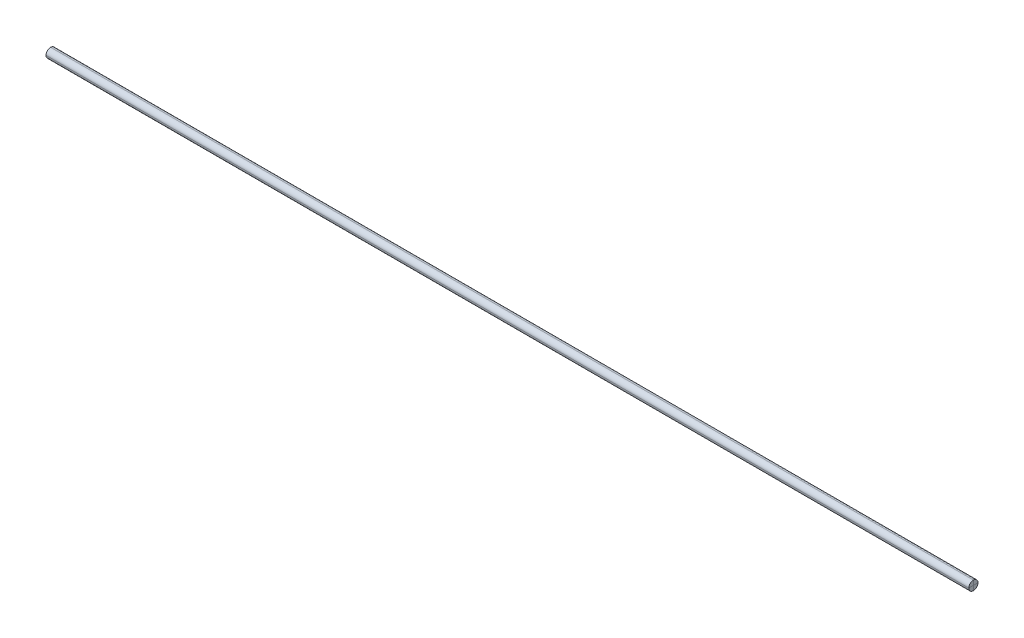
ISO-10303-21;
HEADER;
FILE_DESCRIPTION(('STEP AP214'),'2;1');
FILE_NAME('part.step','',(''),(''),'','','');
FILE_SCHEMA(('AUTOMOTIVE_DESIGN { 1 0 10303 214 1 1 1 1 }'));
ENDSEC;
DATA;
#1=APPLICATION_CONTEXT('core data for automotive mechanical design processes');
#2=APPLICATION_PROTOCOL_DEFINITION('international standard','automotive_design',2000,#1);
#3=PRODUCT_CONTEXT('',#1,'mechanical');
#4=PRODUCT('Part','Part','',(#3));
#5=PRODUCT_RELATED_PRODUCT_CATEGORY('part','',(#4));
#6=PRODUCT_DEFINITION_FORMATION('','',#4);
#7=PRODUCT_DEFINITION_CONTEXT('part definition',#1,'design');
#8=PRODUCT_DEFINITION('design','',#6,#7);
#9=PRODUCT_DEFINITION_SHAPE('','',#8);
#10=(LENGTH_UNIT() NAMED_UNIT(*) SI_UNIT(.MILLI.,.METRE.));
#11=(NAMED_UNIT(*) PLANE_ANGLE_UNIT() SI_UNIT($,.RADIAN.));
#12=(NAMED_UNIT(*) SI_UNIT($,.STERADIAN.) SOLID_ANGLE_UNIT());
#13=UNCERTAINTY_MEASURE_WITH_UNIT(LENGTH_MEASURE(1.E-05),#10,'distance_accuracy_value','');
#14=(GEOMETRIC_REPRESENTATION_CONTEXT(3) GLOBAL_UNCERTAINTY_ASSIGNED_CONTEXT((#13)) GLOBAL_UNIT_ASSIGNED_CONTEXT((#10,
#11,#12)) REPRESENTATION_CONTEXT('',''));
#15=CARTESIAN_POINT('',(0.,0.,0.));
#16=DIRECTION('',(0.,0.,1.));
#17=DIRECTION('',(1.,0.,0.));
#18=AXIS2_PLACEMENT_3D('',#15,#16,#17);
#19=CARTESIAN_POINT('',(0.,0.,0.));
#20=DIRECTION('',(0.,1.,0.));
#21=DIRECTION('',(0.,0.,1.));
#22=AXIS2_PLACEMENT_3D('',#19,#20,#21);
#23=PLANE('',#22);
#24=DIRECTION('',(0.,0.,1.));
#25=VECTOR('',#24,1.);
#26=CARTESIAN_POINT('',(1000.,0.,0.));
#27=LINE('',#26,#25);
#28=CARTESIAN_POINT('',(1000.,0.,-5.));
#29=VERTEX_POINT('',#28);
#30=CARTESIAN_POINT('',(1000.,0.,0.));
#31=VERTEX_POINT('',#30);
#32=EDGE_CURVE('E71',#29,#31,#27,.T.);
#33=ORIENTED_EDGE('',*,*,#32,.F.);
#34=DIRECTION('',(-1.,0.,0.));
#35=VECTOR('',#34,1.);
#36=CARTESIAN_POINT('',(1000.,0.,-5.));
#37=LINE('',#36,#35);
#38=CARTESIAN_POINT('',(0.,0.,-5.));
#39=VERTEX_POINT('',#38);
#40=EDGE_CURVE('E93',#29,#39,#37,.T.);
#41=ORIENTED_EDGE('',*,*,#40,.T.);
#42=DIRECTION('',(0.,0.,1.));
#43=VECTOR('',#42,1.);
#44=CARTESIAN_POINT('',(0.,0.,0.));
#45=LINE('',#44,#43);
#46=CARTESIAN_POINT('',(0.,0.,0.));
#47=VERTEX_POINT('',#46);
#48=EDGE_CURVE('E99',#39,#47,#45,.T.);
#49=ORIENTED_EDGE('',*,*,#48,.T.);
#50=DIRECTION('',(1.,0.,0.));
#51=VECTOR('',#50,1.);
#52=CARTESIAN_POINT('',(0.,0.,0.));
#53=LINE('',#52,#51);
#54=EDGE_CURVE('E58',#47,#31,#53,.T.);
#55=ORIENTED_EDGE('',*,*,#54,.T.);
#56=EDGE_LOOP('',(#33,#41,#49,#55));
#57=FACE_BOUND('',#56,.T.);
#58=ADVANCED_FACE('F54',(#57),#23,.T.);
#59=CARTESIAN_POINT('',(0.,0.,0.));
#60=DIRECTION('',(0.,0.,1.));
#61=DIRECTION('',(1.,0.,0.));
#62=AXIS2_PLACEMENT_3D('',#59,#60,#61);
#63=PLANE('',#62);
#64=DIRECTION('',(0.,-1.,0.));
#65=VECTOR('',#64,1.);
#66=CARTESIAN_POINT('',(1000.,0.,0.));
#67=LINE('',#66,#65);
#68=CARTESIAN_POINT('',(1000.,-5.,0.));
#69=VERTEX_POINT('',#68);
#70=EDGE_CURVE('E78',#31,#69,#67,.T.);
#71=ORIENTED_EDGE('',*,*,#70,.F.);
#72=ORIENTED_EDGE('',*,*,#54,.F.);
#73=DIRECTION('',(0.,-1.,0.));
#74=VECTOR('',#73,1.);
#75=CARTESIAN_POINT('',(0.,0.,0.));
#76=LINE('',#75,#74);
#77=CARTESIAN_POINT('',(0.,-5.,0.));
#78=VERTEX_POINT('',#77);
#79=EDGE_CURVE('E101',#47,#78,#76,.T.);
#80=ORIENTED_EDGE('',*,*,#79,.T.);
#81=DIRECTION('',(-1.,0.,0.));
#82=VECTOR('',#81,1.);
#83=CARTESIAN_POINT('',(1000.,-5.,0.));
#84=LINE('',#83,#82);
#85=EDGE_CURVE('E94',#78,#69,#84,.F.);
#86=ORIENTED_EDGE('',*,*,#85,.T.);
#87=EDGE_LOOP('',(#71,#72,#80,#86));
#88=FACE_BOUND('',#87,.T.);
#89=ADVANCED_FACE('F110',(#88),#63,.T.);
#90=CARTESIAN_POINT('',(1000.,0.,0.));
#91=DIRECTION('',(-1.,0.,0.));
#92=DIRECTION('',(0.,0.,1.));
#93=AXIS2_PLACEMENT_3D('',#90,#91,#92);
#94=CYLINDRICAL_SURFACE('',#93,5.);
#95=ORIENTED_EDGE('',*,*,#85,.F.);
#96=CARTESIAN_POINT('',(0.,0.,0.));
#97=DIRECTION('',(1.,0.,0.));
#98=DIRECTION('',(0.,0.,-1.));
#99=AXIS2_PLACEMENT_3D('',#96,#97,#98);
#100=CIRCLE('',#99,5.);
#101=EDGE_CURVE('E12',#78,#39,#100,.T.);
#102=ORIENTED_EDGE('',*,*,#101,.T.);
#103=ORIENTED_EDGE('',*,*,#40,.F.);
#104=CARTESIAN_POINT('',(1000.,0.,0.));
#105=DIRECTION('',(1.,0.,0.));
#106=DIRECTION('',(0.,0.,-1.));
#107=AXIS2_PLACEMENT_3D('',#104,#105,#106);
#108=CIRCLE('',#107,5.);
#109=EDGE_CURVE('E63',#69,#29,#108,.T.);
#110=ORIENTED_EDGE('',*,*,#109,.F.);
#111=EDGE_LOOP('',(#95,#102,#103,#110));
#112=FACE_BOUND('',#111,.T.);
#113=ADVANCED_FACE('F91',(#112),#94,.T.);
#114=CARTESIAN_POINT('',(0.,0.,0.));
#115=DIRECTION('',(1.,0.,0.));
#116=DIRECTION('',(0.,0.,-1.));
#117=AXIS2_PLACEMENT_3D('',#114,#115,#116);
#118=PLANE('',#117);
#119=ORIENTED_EDGE('',*,*,#79,.F.);
#120=ORIENTED_EDGE('',*,*,#48,.F.);
#121=ORIENTED_EDGE('',*,*,#101,.F.);
#122=EDGE_LOOP('',(#119,#120,#121));
#123=FACE_BOUND('',#122,.T.);
#124=ADVANCED_FACE('F56',(#123),#118,.F.);
#125=CARTESIAN_POINT('',(1000.,0.,0.));
#126=DIRECTION('',(1.,0.,0.));
#127=DIRECTION('',(0.,0.,-1.));
#128=AXIS2_PLACEMENT_3D('',#125,#126,#127);
#129=PLANE('',#128);
#130=ORIENTED_EDGE('',*,*,#32,.T.);
#131=ORIENTED_EDGE('',*,*,#70,.T.);
#132=ORIENTED_EDGE('',*,*,#109,.T.);
#133=EDGE_LOOP('',(#130,#131,#132));
#134=FACE_BOUND('',#133,.T.);
#135=ADVANCED_FACE('F108',(#134),#129,.T.);
#136=CLOSED_SHELL('',(#58,#89,#113,#124,#135));
#137=MANIFOLD_SOLID_BREP('B2',#136);
#138=CARTESIAN_POINT('',(0.,0.,0.));
#139=DIRECTION('',(0.,1.,0.));
#140=DIRECTION('',(0.,0.,1.));
#141=AXIS2_PLACEMENT_3D('',#138,#139,#140);
#142=PLANE('',#141);
#143=DIRECTION('',(0.,0.,1.));
#144=VECTOR('',#143,1.);
#145=CARTESIAN_POINT('',(1000.,0.,0.));
#146=LINE('',#145,#144);
#147=CARTESIAN_POINT('',(1000.,0.,0.));
#148=VERTEX_POINT('',#147);
#149=CARTESIAN_POINT('',(1000.,0.,5.));
#150=VERTEX_POINT('',#149);
#151=EDGE_CURVE('E215',#148,#150,#146,.T.);
#152=ORIENTED_EDGE('',*,*,#151,.T.);
#153=DIRECTION('',(-1.,0.,0.));
#154=VECTOR('',#153,1.);
#155=CARTESIAN_POINT('',(1000.,0.,5.));
#156=LINE('',#155,#154);
#157=CARTESIAN_POINT('',(0.,0.,5.));
#158=VERTEX_POINT('',#157);
#159=EDGE_CURVE('E210',#158,#150,#156,.F.);
#160=ORIENTED_EDGE('',*,*,#159,.F.);
#161=DIRECTION('',(0.,0.,1.));
#162=VECTOR('',#161,1.);
#163=CARTESIAN_POINT('',(0.,0.,0.));
#164=LINE('',#163,#162);
#165=CARTESIAN_POINT('',(0.,0.,0.));
#166=VERTEX_POINT('',#165);
#167=EDGE_CURVE('E192',#166,#158,#164,.T.);
#168=ORIENTED_EDGE('',*,*,#167,.F.);
#169=DIRECTION('',(1.,0.,0.));
#170=VECTOR('',#169,1.);
#171=CARTESIAN_POINT('',(0.,0.,0.));
#172=LINE('',#171,#170);
#173=EDGE_CURVE('E173',#166,#148,#172,.T.);
#174=ORIENTED_EDGE('',*,*,#173,.T.);
#175=EDGE_LOOP('',(#152,#160,#168,#174));
#176=FACE_BOUND('',#175,.T.);
#177=ADVANCED_FACE('F169',(#176),#142,.F.);
#178=CARTESIAN_POINT('',(0.,0.,0.));
#179=DIRECTION('',(0.,0.,1.));
#180=DIRECTION('',(1.,0.,0.));
#181=AXIS2_PLACEMENT_3D('',#178,#179,#180);
#182=PLANE('',#181);
#183=DIRECTION('',(0.,-1.,0.));
#184=VECTOR('',#183,1.);
#185=CARTESIAN_POINT('',(1000.,0.,0.));
#186=LINE('',#185,#184);
#187=CARTESIAN_POINT('',(1000.,5.,0.));
#188=VERTEX_POINT('',#187);
#189=EDGE_CURVE('E208',#188,#148,#186,.T.);
#190=ORIENTED_EDGE('',*,*,#189,.T.);
#191=ORIENTED_EDGE('',*,*,#173,.F.);
#192=DIRECTION('',(0.,-1.,0.));
#193=VECTOR('',#192,1.);
#194=CARTESIAN_POINT('',(0.,0.,0.));
#195=LINE('',#194,#193);
#196=CARTESIAN_POINT('',(0.,5.,0.));
#197=VERTEX_POINT('',#196);
#198=EDGE_CURVE('E209',#197,#166,#195,.T.);
#199=ORIENTED_EDGE('',*,*,#198,.F.);
#200=DIRECTION('',(-1.,0.,0.));
#201=VECTOR('',#200,1.);
#202=CARTESIAN_POINT('',(1000.,5.,0.));
#203=LINE('',#202,#201);
#204=EDGE_CURVE('E184',#188,#197,#203,.T.);
#205=ORIENTED_EDGE('',*,*,#204,.F.);
#206=EDGE_LOOP('',(#190,#191,#199,#205));
#207=FACE_BOUND('',#206,.T.);
#208=ADVANCED_FACE('F206',(#207),#182,.F.);
#209=CARTESIAN_POINT('',(1000.,0.,0.));
#210=DIRECTION('',(-1.,0.,0.));
#211=DIRECTION('',(0.,0.,1.));
#212=AXIS2_PLACEMENT_3D('',#209,#210,#211);
#213=CYLINDRICAL_SURFACE('',#212,5.);
#214=CARTESIAN_POINT('',(1000.,0.,0.));
#215=DIRECTION('',(1.,0.,0.));
#216=DIRECTION('',(0.,0.,-1.));
#217=AXIS2_PLACEMENT_3D('',#214,#215,#216);
#218=CIRCLE('',#217,5.);
#219=EDGE_CURVE('E178',#188,#150,#218,.T.);
#220=ORIENTED_EDGE('',*,*,#219,.F.);
#221=ORIENTED_EDGE('',*,*,#204,.T.);
#222=CARTESIAN_POINT('',(0.,0.,0.));
#223=DIRECTION('',(1.,0.,0.));
#224=DIRECTION('',(0.,0.,-1.));
#225=AXIS2_PLACEMENT_3D('',#222,#223,#224);
#226=CIRCLE('',#225,5.);
#227=EDGE_CURVE('E52',#197,#158,#226,.T.);
#228=ORIENTED_EDGE('',*,*,#227,.T.);
#229=ORIENTED_EDGE('',*,*,#159,.T.);
#230=EDGE_LOOP('',(#220,#221,#228,#229));
#231=FACE_BOUND('',#230,.T.);
#232=ADVANCED_FACE('F218',(#231),#213,.T.);
#233=CARTESIAN_POINT('',(1000.,0.,0.));
#234=DIRECTION('',(1.,0.,0.));
#235=DIRECTION('',(0.,0.,-1.));
#236=AXIS2_PLACEMENT_3D('',#233,#234,#235);
#237=PLANE('',#236);
#238=ORIENTED_EDGE('',*,*,#189,.F.);
#239=ORIENTED_EDGE('',*,*,#219,.T.);
#240=ORIENTED_EDGE('',*,*,#151,.F.);
#241=EDGE_LOOP('',(#238,#239,#240));
#242=FACE_BOUND('',#241,.T.);
#243=ADVANCED_FACE('F171',(#242),#237,.T.);
#244=CARTESIAN_POINT('',(0.,0.,0.));
#245=DIRECTION('',(1.,0.,0.));
#246=DIRECTION('',(0.,0.,-1.));
#247=AXIS2_PLACEMENT_3D('',#244,#245,#246);
#248=PLANE('',#247);
#249=ORIENTED_EDGE('',*,*,#227,.F.);
#250=ORIENTED_EDGE('',*,*,#198,.T.);
#251=ORIENTED_EDGE('',*,*,#167,.T.);
#252=EDGE_LOOP('',(#249,#250,#251));
#253=FACE_BOUND('',#252,.T.);
#254=ADVANCED_FACE('F225',(#253),#248,.F.);
#255=CLOSED_SHELL('',(#177,#208,#232,#243,#254));
#256=MANIFOLD_SOLID_BREP('B6',#255);
#257=CARTESIAN_POINT('',(0.,0.,0.));
#258=DIRECTION('',(0.,0.,1.));
#259=DIRECTION('',(1.,0.,0.));
#260=AXIS2_PLACEMENT_3D('',#257,#258,#259);
#261=PLANE('',#260);
#262=DIRECTION('',(0.,-1.,0.));
#263=VECTOR('',#262,1.);
#264=CARTESIAN_POINT('',(1000.,0.,0.));
#265=LINE('',#264,#263);
#266=CARTESIAN_POINT('',(1000.,0.,0.));
#267=VERTEX_POINT('',#266);
#268=CARTESIAN_POINT('',(1000.,-5.,0.));
#269=VERTEX_POINT('',#268);
#270=EDGE_CURVE('E329',#267,#269,#265,.T.);
#271=ORIENTED_EDGE('',*,*,#270,.T.);
#272=DIRECTION('',(-1.,0.,0.));
#273=VECTOR('',#272,1.);
#274=CARTESIAN_POINT('',(1000.,-5.,0.));
#275=LINE('',#274,#273);
#276=CARTESIAN_POINT('',(0.,-5.,0.));
#277=VERTEX_POINT('',#276);
#278=EDGE_CURVE('E328',#277,#269,#275,.F.);
#279=ORIENTED_EDGE('',*,*,#278,.F.);
#280=DIRECTION('',(0.,-1.,0.));
#281=VECTOR('',#280,1.);
#282=CARTESIAN_POINT('',(0.,0.,0.));
#283=LINE('',#282,#281);
#284=CARTESIAN_POINT('',(0.,0.,0.));
#285=VERTEX_POINT('',#284);
#286=EDGE_CURVE('E299',#285,#277,#283,.T.);
#287=ORIENTED_EDGE('',*,*,#286,.F.);
#288=DIRECTION('',(1.,0.,0.));
#289=VECTOR('',#288,1.);
#290=CARTESIAN_POINT('',(0.,0.,0.));
#291=LINE('',#290,#289);
#292=EDGE_CURVE('E285',#285,#267,#291,.T.);
#293=ORIENTED_EDGE('',*,*,#292,.T.);
#294=EDGE_LOOP('',(#271,#279,#287,#293));
#295=FACE_BOUND('',#294,.T.);
#296=ADVANCED_FACE('F281',(#295),#261,.F.);
#297=CARTESIAN_POINT('',(0.,0.,0.));
#298=DIRECTION('',(0.,1.,0.));
#299=DIRECTION('',(0.,0.,1.));
#300=AXIS2_PLACEMENT_3D('',#297,#298,#299);
#301=PLANE('',#300);
#302=DIRECTION('',(0.,0.,1.));
#303=VECTOR('',#302,1.);
#304=CARTESIAN_POINT('',(1000.,0.,0.));
#305=LINE('',#304,#303);
#306=CARTESIAN_POINT('',(1000.,0.,5.));
#307=VERTEX_POINT('',#306);
#308=EDGE_CURVE('E307',#267,#307,#305,.T.);
#309=ORIENTED_EDGE('',*,*,#308,.F.);
#310=ORIENTED_EDGE('',*,*,#292,.F.);
#311=DIRECTION('',(0.,0.,1.));
#312=VECTOR('',#311,1.);
#313=CARTESIAN_POINT('',(0.,0.,0.));
#314=LINE('',#313,#312);
#315=CARTESIAN_POINT('',(0.,0.,5.));
#316=VERTEX_POINT('',#315);
#317=EDGE_CURVE('E322',#285,#316,#314,.T.);
#318=ORIENTED_EDGE('',*,*,#317,.T.);
#319=DIRECTION('',(-1.,0.,0.));
#320=VECTOR('',#319,1.);
#321=CARTESIAN_POINT('',(1000.,0.,5.));
#322=LINE('',#321,#320);
#323=EDGE_CURVE('E325',#316,#307,#322,.F.);
#324=ORIENTED_EDGE('',*,*,#323,.T.);
#325=EDGE_LOOP('',(#309,#310,#318,#324));
#326=FACE_BOUND('',#325,.T.);
#327=ADVANCED_FACE('F331',(#326),#301,.T.);
#328=CARTESIAN_POINT('',(1000.,0.,0.));
#329=DIRECTION('',(-1.,0.,0.));
#330=DIRECTION('',(0.,0.,1.));
#331=AXIS2_PLACEMENT_3D('',#328,#329,#330);
#332=CYLINDRICAL_SURFACE('',#331,5.);
#333=ORIENTED_EDGE('',*,*,#323,.F.);
#334=CARTESIAN_POINT('',(0.,0.,0.));
#335=DIRECTION('',(1.,0.,0.));
#336=DIRECTION('',(0.,0.,-1.));
#337=AXIS2_PLACEMENT_3D('',#334,#335,#336);
#338=CIRCLE('',#337,5.);
#339=EDGE_CURVE('E167',#316,#277,#338,.T.);
#340=ORIENTED_EDGE('',*,*,#339,.T.);
#341=ORIENTED_EDGE('',*,*,#278,.T.);
#342=CARTESIAN_POINT('',(1000.,0.,0.));
#343=DIRECTION('',(1.,0.,0.));
#344=DIRECTION('',(0.,0.,-1.));
#345=AXIS2_PLACEMENT_3D('',#342,#343,#344);
#346=CIRCLE('',#345,5.);
#347=EDGE_CURVE('E291',#307,#269,#346,.T.);
#348=ORIENTED_EDGE('',*,*,#347,.F.);
#349=EDGE_LOOP('',(#333,#340,#341,#348));
#350=FACE_BOUND('',#349,.T.);
#351=ADVANCED_FACE('F326',(#350),#332,.T.);
#352=CARTESIAN_POINT('',(0.,0.,0.));
#353=DIRECTION('',(1.,0.,0.));
#354=DIRECTION('',(0.,0.,-1.));
#355=AXIS2_PLACEMENT_3D('',#352,#353,#354);
#356=PLANE('',#355);
#357=ORIENTED_EDGE('',*,*,#317,.F.);
#358=ORIENTED_EDGE('',*,*,#286,.T.);
#359=ORIENTED_EDGE('',*,*,#339,.F.);
#360=EDGE_LOOP('',(#357,#358,#359));
#361=FACE_BOUND('',#360,.T.);
#362=ADVANCED_FACE('F320',(#361),#356,.F.);
#363=CARTESIAN_POINT('',(1000.,0.,0.));
#364=DIRECTION('',(1.,0.,0.));
#365=DIRECTION('',(0.,0.,-1.));
#366=AXIS2_PLACEMENT_3D('',#363,#364,#365);
#367=PLANE('',#366);
#368=ORIENTED_EDGE('',*,*,#270,.F.);
#369=ORIENTED_EDGE('',*,*,#308,.T.);
#370=ORIENTED_EDGE('',*,*,#347,.T.);
#371=EDGE_LOOP('',(#368,#369,#370));
#372=FACE_BOUND('',#371,.T.);
#373=ADVANCED_FACE('F283',(#372),#367,.T.);
#374=CLOSED_SHELL('',(#296,#327,#351,#362,#373));
#375=MANIFOLD_SOLID_BREP('B46',#374);
#376=CARTESIAN_POINT('',(0.,0.,0.));
#377=DIRECTION('',(0.,1.,0.));
#378=DIRECTION('',(0.,0.,1.));
#379=AXIS2_PLACEMENT_3D('',#376,#377,#378);
#380=PLANE('',#379);
#381=DIRECTION('',(0.,0.,1.));
#382=VECTOR('',#381,1.);
#383=CARTESIAN_POINT('',(1000.,0.,0.));
#384=LINE('',#383,#382);
#385=CARTESIAN_POINT('',(1000.,0.,-5.));
#386=VERTEX_POINT('',#385);
#387=CARTESIAN_POINT('',(1000.,0.,0.));
#388=VERTEX_POINT('',#387);
#389=EDGE_CURVE('E393',#386,#388,#384,.T.);
#390=ORIENTED_EDGE('',*,*,#389,.T.);
#391=DIRECTION('',(1.,0.,0.));
#392=VECTOR('',#391,1.);
#393=CARTESIAN_POINT('',(0.,0.,0.));
#394=LINE('',#393,#392);
#395=CARTESIAN_POINT('',(0.,0.,0.));
#396=VERTEX_POINT('',#395);
#397=EDGE_CURVE('E430',#396,#388,#394,.T.);
#398=ORIENTED_EDGE('',*,*,#397,.F.);
#399=DIRECTION('',(0.,0.,1.));
#400=VECTOR('',#399,1.);
#401=CARTESIAN_POINT('',(0.,0.,0.));
#402=LINE('',#401,#400);
#403=CARTESIAN_POINT('',(0.,0.,-5.));
#404=VERTEX_POINT('',#403);
#405=EDGE_CURVE('E408',#404,#396,#402,.T.);
#406=ORIENTED_EDGE('',*,*,#405,.F.);
#407=DIRECTION('',(-1.,0.,0.));
#408=VECTOR('',#407,1.);
#409=CARTESIAN_POINT('',(1000.,0.,-5.));
#410=LINE('',#409,#408);
#411=EDGE_CURVE('E421',#386,#404,#410,.T.);
#412=ORIENTED_EDGE('',*,*,#411,.F.);
#413=EDGE_LOOP('',(#390,#398,#406,#412));
#414=FACE_BOUND('',#413,.T.);
#415=ADVANCED_FACE('F384',(#414),#380,.F.);
#416=CARTESIAN_POINT('',(0.,0.,0.));
#417=DIRECTION('',(0.,0.,1.));
#418=DIRECTION('',(1.,0.,0.));
#419=AXIS2_PLACEMENT_3D('',#416,#417,#418);
#420=PLANE('',#419);
#421=DIRECTION('',(0.,-1.,0.));
#422=VECTOR('',#421,1.);
#423=CARTESIAN_POINT('',(1000.,0.,0.));
#424=LINE('',#423,#422);
#425=CARTESIAN_POINT('',(1000.,5.,0.));
#426=VERTEX_POINT('',#425);
#427=EDGE_CURVE('E388',#426,#388,#424,.T.);
#428=ORIENTED_EDGE('',*,*,#427,.F.);
#429=DIRECTION('',(-1.,0.,0.));
#430=VECTOR('',#429,1.);
#431=CARTESIAN_POINT('',(1000.,5.,0.));
#432=LINE('',#431,#430);
#433=CARTESIAN_POINT('',(0.,5.,0.));
#434=VERTEX_POINT('',#433);
#435=EDGE_CURVE('E428',#426,#434,#432,.T.);
#436=ORIENTED_EDGE('',*,*,#435,.T.);
#437=DIRECTION('',(0.,-1.,0.));
#438=VECTOR('',#437,1.);
#439=CARTESIAN_POINT('',(0.,0.,0.));
#440=LINE('',#439,#438);
#441=EDGE_CURVE('E279',#434,#396,#440,.T.);
#442=ORIENTED_EDGE('',*,*,#441,.T.);
#443=ORIENTED_EDGE('',*,*,#397,.T.);
#444=EDGE_LOOP('',(#428,#436,#442,#443));
#445=FACE_BOUND('',#444,.T.);
#446=ADVANCED_FACE('F386',(#445),#420,.T.);
#447=CARTESIAN_POINT('',(1000.,0.,0.));
#448=DIRECTION('',(-1.,0.,0.));
#449=DIRECTION('',(0.,0.,1.));
#450=AXIS2_PLACEMENT_3D('',#447,#448,#449);
#451=CYLINDRICAL_SURFACE('',#450,5.);
#452=ORIENTED_EDGE('',*,*,#435,.F.);
#453=CARTESIAN_POINT('',(1000.,0.,0.));
#454=DIRECTION('',(1.,0.,0.));
#455=DIRECTION('',(0.,0.,-1.));
#456=AXIS2_PLACEMENT_3D('',#453,#454,#455);
#457=CIRCLE('',#456,5.);
#458=EDGE_CURVE('E424',#386,#426,#457,.T.);
#459=ORIENTED_EDGE('',*,*,#458,.F.);
#460=ORIENTED_EDGE('',*,*,#411,.T.);
#461=CARTESIAN_POINT('',(0.,0.,0.));
#462=DIRECTION('',(1.,0.,0.));
#463=DIRECTION('',(0.,0.,-1.));
#464=AXIS2_PLACEMENT_3D('',#461,#462,#463);
#465=CIRCLE('',#464,5.);
#466=EDGE_CURVE('E401',#404,#434,#465,.T.);
#467=ORIENTED_EDGE('',*,*,#466,.T.);
#468=EDGE_LOOP('',(#452,#459,#460,#467));
#469=FACE_BOUND('',#468,.T.);
#470=ADVANCED_FACE('F422',(#469),#451,.T.);
#471=CARTESIAN_POINT('',(0.,0.,0.));
#472=DIRECTION('',(1.,0.,0.));
#473=DIRECTION('',(0.,0.,-1.));
#474=AXIS2_PLACEMENT_3D('',#471,#472,#473);
#475=PLANE('',#474);
#476=ORIENTED_EDGE('',*,*,#441,.F.);
#477=ORIENTED_EDGE('',*,*,#466,.F.);
#478=ORIENTED_EDGE('',*,*,#405,.T.);
#479=EDGE_LOOP('',(#476,#477,#478));
#480=FACE_BOUND('',#479,.T.);
#481=ADVANCED_FACE('F432',(#480),#475,.F.);
#482=CARTESIAN_POINT('',(1000.,0.,0.));
#483=DIRECTION('',(1.,0.,0.));
#484=DIRECTION('',(0.,0.,-1.));
#485=AXIS2_PLACEMENT_3D('',#482,#483,#484);
#486=PLANE('',#485);
#487=ORIENTED_EDGE('',*,*,#458,.T.);
#488=ORIENTED_EDGE('',*,*,#427,.T.);
#489=ORIENTED_EDGE('',*,*,#389,.F.);
#490=EDGE_LOOP('',(#487,#488,#489));
#491=FACE_BOUND('',#490,.T.);
#492=ADVANCED_FACE('F440',(#491),#486,.T.);
#493=CLOSED_SHELL('',(#415,#446,#470,#481,#492));
#494=MANIFOLD_SOLID_BREP('B161',#493);
#495=ADVANCED_BREP_SHAPE_REPRESENTATION('',(#18,#137,#256,#375,#494),#14);
#496=SHAPE_DEFINITION_REPRESENTATION(#9,#495);
ENDSEC;
END-ISO-10303-21;
